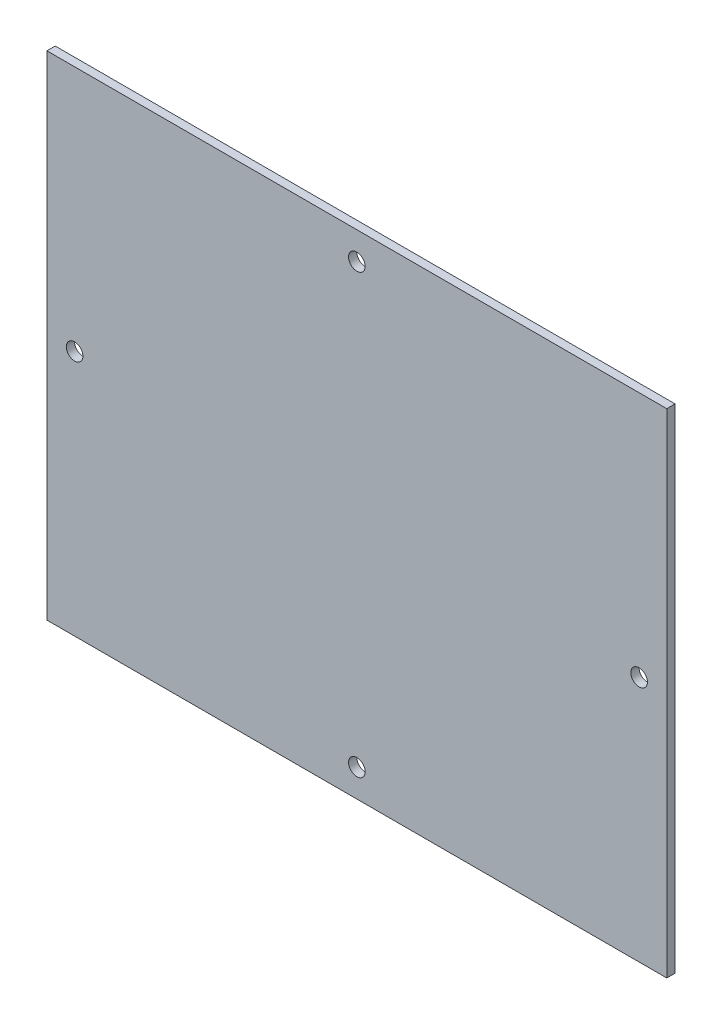
ISO-10303-21;
HEADER;
FILE_DESCRIPTION(('STEP AP214'),'2;1');
FILE_NAME('part.step','',(''),(''),'','','');
FILE_SCHEMA(('AUTOMOTIVE_DESIGN { 1 0 10303 214 1 1 1 1 }'));
ENDSEC;
DATA;
#1=APPLICATION_CONTEXT('core data for automotive mechanical design processes');
#2=APPLICATION_PROTOCOL_DEFINITION('international standard','automotive_design',2000,#1);
#3=PRODUCT_CONTEXT('',#1,'mechanical');
#4=PRODUCT('Part','Part','',(#3));
#5=PRODUCT_RELATED_PRODUCT_CATEGORY('part','',(#4));
#6=PRODUCT_DEFINITION_FORMATION('','',#4);
#7=PRODUCT_DEFINITION_CONTEXT('part definition',#1,'design');
#8=PRODUCT_DEFINITION('design','',#6,#7);
#9=PRODUCT_DEFINITION_SHAPE('','',#8);
#10=(LENGTH_UNIT() NAMED_UNIT(*) SI_UNIT(.MILLI.,.METRE.));
#11=(NAMED_UNIT(*) PLANE_ANGLE_UNIT() SI_UNIT($,.RADIAN.));
#12=(NAMED_UNIT(*) SI_UNIT($,.STERADIAN.) SOLID_ANGLE_UNIT());
#13=UNCERTAINTY_MEASURE_WITH_UNIT(LENGTH_MEASURE(1.E-05),#10,'distance_accuracy_value','');
#14=(GEOMETRIC_REPRESENTATION_CONTEXT(3) GLOBAL_UNCERTAINTY_ASSIGNED_CONTEXT((#13)) GLOBAL_UNIT_ASSIGNED_CONTEXT((#10,
#11,#12)) REPRESENTATION_CONTEXT('',''));
#15=CARTESIAN_POINT('',(0.,0.,0.));
#16=DIRECTION('',(0.,0.,1.));
#17=DIRECTION('',(1.,0.,0.));
#18=AXIS2_PLACEMENT_3D('',#15,#16,#17);
#19=CARTESIAN_POINT('',(0.,0.,1.5));
#20=DIRECTION('',(0.,0.,1.));
#21=DIRECTION('',(1.,0.,0.));
#22=AXIS2_PLACEMENT_3D('',#19,#20,#21);
#23=PLANE('',#22);
#24=CARTESIAN_POINT('',(-60.2101419700237,20.1519747363426,1.49999999999999));
#25=DIRECTION('',(0.,0.,1.));
#26=DIRECTION('',(-1.,0.,0.));
#27=AXIS2_PLACEMENT_3D('',#24,#25,#26);
#28=CIRCLE('',#27,1.5);
#29=CARTESIAN_POINT('',(-61.7101419700237,20.1519747363426,1.49999999999999));
#30=VERTEX_POINT('',#29);
#31=EDGE_CURVE('E142',#30,#30,#28,.T.);
#32=ORIENTED_EDGE('',*,*,#31,.F.);
#33=EDGE_LOOP('',(#32));
#34=FACE_BOUND('',#33,.T.);
#35=CARTESIAN_POINT('',(-60.2101419700237,99.2419747363427,1.49999999999998));
#36=DIRECTION('',(0.,0.,1.));
#37=DIRECTION('',(1.,0.,0.));
#38=AXIS2_PLACEMENT_3D('',#35,#36,#37);
#39=CIRCLE('',#38,1.5);
#40=CARTESIAN_POINT('',(-58.7101419700237,99.2419747363427,1.49999999999998));
#41=VERTEX_POINT('',#40);
#42=EDGE_CURVE('E111',#41,#41,#39,.T.);
#43=ORIENTED_EDGE('',*,*,#42,.F.);
#44=EDGE_LOOP('',(#43));
#45=FACE_BOUND('',#44,.T.);
#46=DIRECTION('',(-1.,0.,0.));
#47=VECTOR('',#46,1.);
#48=CARTESIAN_POINT('',(-116.210141970024,104.241974736343,1.49999999999997));
#49=LINE('',#48,#47);
#50=CARTESIAN_POINT('',(-4.21014197002367,104.241974736343,1.49999999999997));
#51=VERTEX_POINT('',#50);
#52=CARTESIAN_POINT('',(-116.210141970024,104.241974736343,1.49999999999997));
#53=VERTEX_POINT('',#52);
#54=EDGE_CURVE('E89',#51,#53,#49,.T.);
#55=ORIENTED_EDGE('',*,*,#54,.T.);
#56=DIRECTION('',(0.,-1.,0.));
#57=VECTOR('',#56,1.);
#58=CARTESIAN_POINT('',(-116.210141970024,15.1519747363427,1.5));
#59=LINE('',#58,#57);
#60=CARTESIAN_POINT('',(-116.210141970024,15.1519747363427,1.5));
#61=VERTEX_POINT('',#60);
#62=EDGE_CURVE('E84',#53,#61,#59,.T.);
#63=ORIENTED_EDGE('',*,*,#62,.T.);
#64=DIRECTION('',(1.,0.,0.));
#65=VECTOR('',#64,1.);
#66=CARTESIAN_POINT('',(-116.210141970024,15.1519747363427,1.5));
#67=LINE('',#66,#65);
#68=CARTESIAN_POINT('',(-4.21014197002367,15.1519747363427,1.5));
#69=VERTEX_POINT('',#68);
#70=EDGE_CURVE('E87',#61,#69,#67,.T.);
#71=ORIENTED_EDGE('',*,*,#70,.T.);
#72=DIRECTION('',(0.,1.,0.));
#73=VECTOR('',#72,1.);
#74=CARTESIAN_POINT('',(-4.21014197002367,15.1519747363427,1.5));
#75=LINE('',#74,#73);
#76=EDGE_CURVE('E54',#69,#51,#75,.T.);
#77=ORIENTED_EDGE('',*,*,#76,.T.);
#78=EDGE_LOOP('',(#55,#63,#71,#77));
#79=FACE_BOUND('',#78,.T.);
#80=CARTESIAN_POINT('',(-111.210141970024,59.6969747363427,1.49999999999999));
#81=DIRECTION('',(0.,0.,1.));
#82=DIRECTION('',(1.,0.,0.));
#83=AXIS2_PLACEMENT_3D('',#80,#81,#82);
#84=CIRCLE('',#83,1.5);
#85=CARTESIAN_POINT('',(-109.710141970024,59.6969747363427,1.49999999999999));
#86=VERTEX_POINT('',#85);
#87=EDGE_CURVE('E134',#86,#86,#84,.T.);
#88=ORIENTED_EDGE('',*,*,#87,.F.);
#89=EDGE_LOOP('',(#88));
#90=FACE_BOUND('',#89,.T.);
#91=CARTESIAN_POINT('',(-9.21014197002369,59.6969747363427,1.49999999999999));
#92=DIRECTION('',(0.,0.,1.));
#93=DIRECTION('',(-1.,0.,0.));
#94=AXIS2_PLACEMENT_3D('',#91,#92,#93);
#95=CIRCLE('',#94,1.5);
#96=CARTESIAN_POINT('',(-10.7101419700237,59.6969747363427,1.49999999999999));
#97=VERTEX_POINT('',#96);
#98=EDGE_CURVE('E148',#97,#97,#95,.T.);
#99=ORIENTED_EDGE('',*,*,#98,.F.);
#100=EDGE_LOOP('',(#99));
#101=FACE_BOUND('',#100,.T.);
#102=ADVANCED_FACE('F36',(#34,#45,#79,#90,#101),#23,.T.);
#103=CARTESIAN_POINT('',(0.,0.,0.));
#104=DIRECTION('',(0.,0.,1.));
#105=DIRECTION('',(1.,0.,0.));
#106=AXIS2_PLACEMENT_3D('',#103,#104,#105);
#107=PLANE('',#106);
#108=DIRECTION('',(-1.,0.,0.));
#109=VECTOR('',#108,1.);
#110=CARTESIAN_POINT('',(-116.210141970024,104.241974736343,0.));
#111=LINE('',#110,#109);
#112=CARTESIAN_POINT('',(-4.21014197002367,104.241974736343,0.));
#113=VERTEX_POINT('',#112);
#114=CARTESIAN_POINT('',(-116.210141970024,104.241974736343,0.));
#115=VERTEX_POINT('',#114);
#116=EDGE_CURVE('E107',#113,#115,#111,.T.);
#117=ORIENTED_EDGE('',*,*,#116,.F.);
#118=DIRECTION('',(0.,1.,0.));
#119=VECTOR('',#118,1.);
#120=CARTESIAN_POINT('',(-4.21014197002367,15.1519747363427,0.));
#121=LINE('',#120,#119);
#122=CARTESIAN_POINT('',(-4.21014197002367,15.1519747363427,0.));
#123=VERTEX_POINT('',#122);
#124=EDGE_CURVE('E77',#123,#113,#121,.T.);
#125=ORIENTED_EDGE('',*,*,#124,.F.);
#126=DIRECTION('',(1.,0.,0.));
#127=VECTOR('',#126,1.);
#128=CARTESIAN_POINT('',(-116.210141970024,15.1519747363427,0.));
#129=LINE('',#128,#127);
#130=CARTESIAN_POINT('',(-116.210141970024,15.1519747363427,0.));
#131=VERTEX_POINT('',#130);
#132=EDGE_CURVE('E71',#131,#123,#129,.T.);
#133=ORIENTED_EDGE('',*,*,#132,.F.);
#134=DIRECTION('',(0.,-1.,0.));
#135=VECTOR('',#134,1.);
#136=CARTESIAN_POINT('',(-116.210141970024,15.1519747363427,0.));
#137=LINE('',#136,#135);
#138=EDGE_CURVE('E94',#115,#131,#137,.T.);
#139=ORIENTED_EDGE('',*,*,#138,.F.);
#140=EDGE_LOOP('',(#117,#125,#133,#139));
#141=FACE_BOUND('',#140,.T.);
#142=CARTESIAN_POINT('',(-60.2101419700237,99.2419747363427,0.));
#143=DIRECTION('',(0.,0.,1.));
#144=DIRECTION('',(1.,0.,0.));
#145=AXIS2_PLACEMENT_3D('',#142,#143,#144);
#146=CIRCLE('',#145,1.5);
#147=CARTESIAN_POINT('',(-58.7101419700237,99.2419747363427,0.));
#148=VERTEX_POINT('',#147);
#149=EDGE_CURVE('E130',#148,#148,#146,.T.);
#150=ORIENTED_EDGE('',*,*,#149,.T.);
#151=EDGE_LOOP('',(#150));
#152=FACE_BOUND('',#151,.T.);
#153=CARTESIAN_POINT('',(-111.210141970024,59.6969747363427,0.));
#154=DIRECTION('',(0.,0.,1.));
#155=DIRECTION('',(1.,0.,0.));
#156=AXIS2_PLACEMENT_3D('',#153,#154,#155);
#157=CIRCLE('',#156,1.5);
#158=CARTESIAN_POINT('',(-109.710141970024,59.6969747363427,0.));
#159=VERTEX_POINT('',#158);
#160=EDGE_CURVE('E138',#159,#159,#157,.T.);
#161=ORIENTED_EDGE('',*,*,#160,.T.);
#162=EDGE_LOOP('',(#161));
#163=FACE_BOUND('',#162,.T.);
#164=CARTESIAN_POINT('',(-60.2101419700237,20.1519747363426,0.));
#165=DIRECTION('',(0.,0.,1.));
#166=DIRECTION('',(-1.,0.,0.));
#167=AXIS2_PLACEMENT_3D('',#164,#165,#166);
#168=CIRCLE('',#167,1.5);
#169=CARTESIAN_POINT('',(-61.7101419700237,20.1519747363426,0.));
#170=VERTEX_POINT('',#169);
#171=EDGE_CURVE('E145',#170,#170,#168,.T.);
#172=ORIENTED_EDGE('',*,*,#171,.T.);
#173=EDGE_LOOP('',(#172));
#174=FACE_BOUND('',#173,.T.);
#175=CARTESIAN_POINT('',(-9.21014197002369,59.6969747363427,0.));
#176=DIRECTION('',(0.,0.,1.));
#177=DIRECTION('',(-1.,0.,0.));
#178=AXIS2_PLACEMENT_3D('',#175,#176,#177);
#179=CIRCLE('',#178,1.5);
#180=CARTESIAN_POINT('',(-10.7101419700237,59.6969747363427,0.));
#181=VERTEX_POINT('',#180);
#182=EDGE_CURVE('E151',#181,#181,#179,.T.);
#183=ORIENTED_EDGE('',*,*,#182,.T.);
#184=EDGE_LOOP('',(#183));
#185=FACE_BOUND('',#184,.T.);
#186=ADVANCED_FACE('F124',(#141,#152,#163,#174,#185),#107,.F.);
#187=CARTESIAN_POINT('',(-116.210141970024,104.241974736343,1.49999999999997));
#188=DIRECTION('',(0.,-1.,0.));
#189=DIRECTION('',(0.,0.,-1.));
#190=AXIS2_PLACEMENT_3D('',#187,#188,#189);
#191=PLANE('',#190);
#192=ORIENTED_EDGE('',*,*,#116,.T.);
#193=DIRECTION('',(0.,0.,-1.));
#194=VECTOR('',#193,1.);
#195=CARTESIAN_POINT('',(-116.210141970024,104.241974736343,1.49999999999997));
#196=LINE('',#195,#194);
#197=EDGE_CURVE('E11',#53,#115,#196,.T.);
#198=ORIENTED_EDGE('',*,*,#197,.F.);
#199=ORIENTED_EDGE('',*,*,#54,.F.);
#200=DIRECTION('',(0.,0.,-1.));
#201=VECTOR('',#200,1.);
#202=CARTESIAN_POINT('',(-4.21014197002367,104.241974736343,1.49999999999997));
#203=LINE('',#202,#201);
#204=EDGE_CURVE('E103',#51,#113,#203,.T.);
#205=ORIENTED_EDGE('',*,*,#204,.T.);
#206=EDGE_LOOP('',(#192,#198,#199,#205));
#207=FACE_BOUND('',#206,.T.);
#208=ADVANCED_FACE('F38',(#207),#191,.F.);
#209=CARTESIAN_POINT('',(-116.210141970024,15.1519747363427,1.5));
#210=DIRECTION('',(1.,0.,0.));
#211=DIRECTION('',(0.,0.,-1.));
#212=AXIS2_PLACEMENT_3D('',#209,#210,#211);
#213=PLANE('',#212);
#214=ORIENTED_EDGE('',*,*,#138,.T.);
#215=DIRECTION('',(0.,0.,-1.));
#216=VECTOR('',#215,1.);
#217=CARTESIAN_POINT('',(-116.210141970024,15.1519747363427,1.5));
#218=LINE('',#217,#216);
#219=EDGE_CURVE('E46',#61,#131,#218,.T.);
#220=ORIENTED_EDGE('',*,*,#219,.F.);
#221=ORIENTED_EDGE('',*,*,#62,.F.);
#222=ORIENTED_EDGE('',*,*,#197,.T.);
#223=EDGE_LOOP('',(#214,#220,#221,#222));
#224=FACE_BOUND('',#223,.T.);
#225=ADVANCED_FACE('F93',(#224),#213,.F.);
#226=CARTESIAN_POINT('',(-116.210141970024,15.1519747363427,1.5));
#227=DIRECTION('',(0.,1.,0.));
#228=DIRECTION('',(0.,0.,1.));
#229=AXIS2_PLACEMENT_3D('',#226,#227,#228);
#230=PLANE('',#229);
#231=ORIENTED_EDGE('',*,*,#132,.T.);
#232=DIRECTION('',(0.,0.,-1.));
#233=VECTOR('',#232,1.);
#234=CARTESIAN_POINT('',(-4.21014197002367,15.1519747363427,1.5));
#235=LINE('',#234,#233);
#236=EDGE_CURVE('E96',#69,#123,#235,.T.);
#237=ORIENTED_EDGE('',*,*,#236,.F.);
#238=ORIENTED_EDGE('',*,*,#70,.F.);
#239=ORIENTED_EDGE('',*,*,#219,.T.);
#240=EDGE_LOOP('',(#231,#237,#238,#239));
#241=FACE_BOUND('',#240,.T.);
#242=ADVANCED_FACE('F97',(#241),#230,.F.);
#243=CARTESIAN_POINT('',(-4.21014197002367,15.1519747363427,1.5));
#244=DIRECTION('',(-1.,0.,0.));
#245=DIRECTION('',(0.,0.,1.));
#246=AXIS2_PLACEMENT_3D('',#243,#244,#245);
#247=PLANE('',#246);
#248=ORIENTED_EDGE('',*,*,#124,.T.);
#249=ORIENTED_EDGE('',*,*,#204,.F.);
#250=ORIENTED_EDGE('',*,*,#76,.F.);
#251=ORIENTED_EDGE('',*,*,#236,.T.);
#252=EDGE_LOOP('',(#248,#249,#250,#251));
#253=FACE_BOUND('',#252,.T.);
#254=ADVANCED_FACE('F121',(#253),#247,.F.);
#255=CARTESIAN_POINT('',(-60.2101419700237,99.2419747363427,1.49999999999998));
#256=DIRECTION('',(0.,0.,-1.));
#257=DIRECTION('',(-1.,0.,0.));
#258=AXIS2_PLACEMENT_3D('',#255,#256,#257);
#259=CYLINDRICAL_SURFACE('',#258,1.5);
#260=ORIENTED_EDGE('',*,*,#42,.T.);
#261=EDGE_LOOP('',(#260));
#262=FACE_BOUND('',#261,.T.);
#263=ORIENTED_EDGE('',*,*,#149,.F.);
#264=EDGE_LOOP('',(#263));
#265=FACE_BOUND('',#264,.T.);
#266=ADVANCED_FACE('F172',(#262,#265),#259,.F.);
#267=CARTESIAN_POINT('',(-111.210141970024,59.6969747363427,1.49999999999999));
#268=DIRECTION('',(0.,0.,-1.));
#269=DIRECTION('',(-1.,0.,0.));
#270=AXIS2_PLACEMENT_3D('',#267,#268,#269);
#271=CYLINDRICAL_SURFACE('',#270,1.5);
#272=ORIENTED_EDGE('',*,*,#87,.T.);
#273=EDGE_LOOP('',(#272));
#274=FACE_BOUND('',#273,.T.);
#275=ORIENTED_EDGE('',*,*,#160,.F.);
#276=EDGE_LOOP('',(#275));
#277=FACE_BOUND('',#276,.T.);
#278=ADVANCED_FACE('F221',(#274,#277),#271,.F.);
#279=CARTESIAN_POINT('',(-60.2101419700237,20.1519747363426,1.49999999999999));
#280=DIRECTION('',(0.,0.,-1.));
#281=DIRECTION('',(-1.,0.,0.));
#282=AXIS2_PLACEMENT_3D('',#279,#280,#281);
#283=CYLINDRICAL_SURFACE('',#282,1.5);
#284=ORIENTED_EDGE('',*,*,#31,.T.);
#285=EDGE_LOOP('',(#284));
#286=FACE_BOUND('',#285,.T.);
#287=ORIENTED_EDGE('',*,*,#171,.F.);
#288=EDGE_LOOP('',(#287));
#289=FACE_BOUND('',#288,.T.);
#290=ADVANCED_FACE('F229',(#286,#289),#283,.F.);
#291=CARTESIAN_POINT('',(-9.21014197002369,59.6969747363427,1.49999999999999));
#292=DIRECTION('',(0.,0.,-1.));
#293=DIRECTION('',(-1.,0.,0.));
#294=AXIS2_PLACEMENT_3D('',#291,#292,#293);
#295=CYLINDRICAL_SURFACE('',#294,1.5);
#296=ORIENTED_EDGE('',*,*,#98,.T.);
#297=EDGE_LOOP('',(#296));
#298=FACE_BOUND('',#297,.T.);
#299=ORIENTED_EDGE('',*,*,#182,.F.);
#300=EDGE_LOOP('',(#299));
#301=FACE_BOUND('',#300,.T.);
#302=ADVANCED_FACE('F159',(#298,#301),#295,.F.);
#303=CLOSED_SHELL('',(#102,#186,#208,#225,#242,#254,#266,#278,#290,#302));
#304=MANIFOLD_SOLID_BREP('B2',#303);
#305=ADVANCED_BREP_SHAPE_REPRESENTATION('',(#18,#304),#14);
#306=SHAPE_DEFINITION_REPRESENTATION(#9,#305);
ENDSEC;
END-ISO-10303-21;
